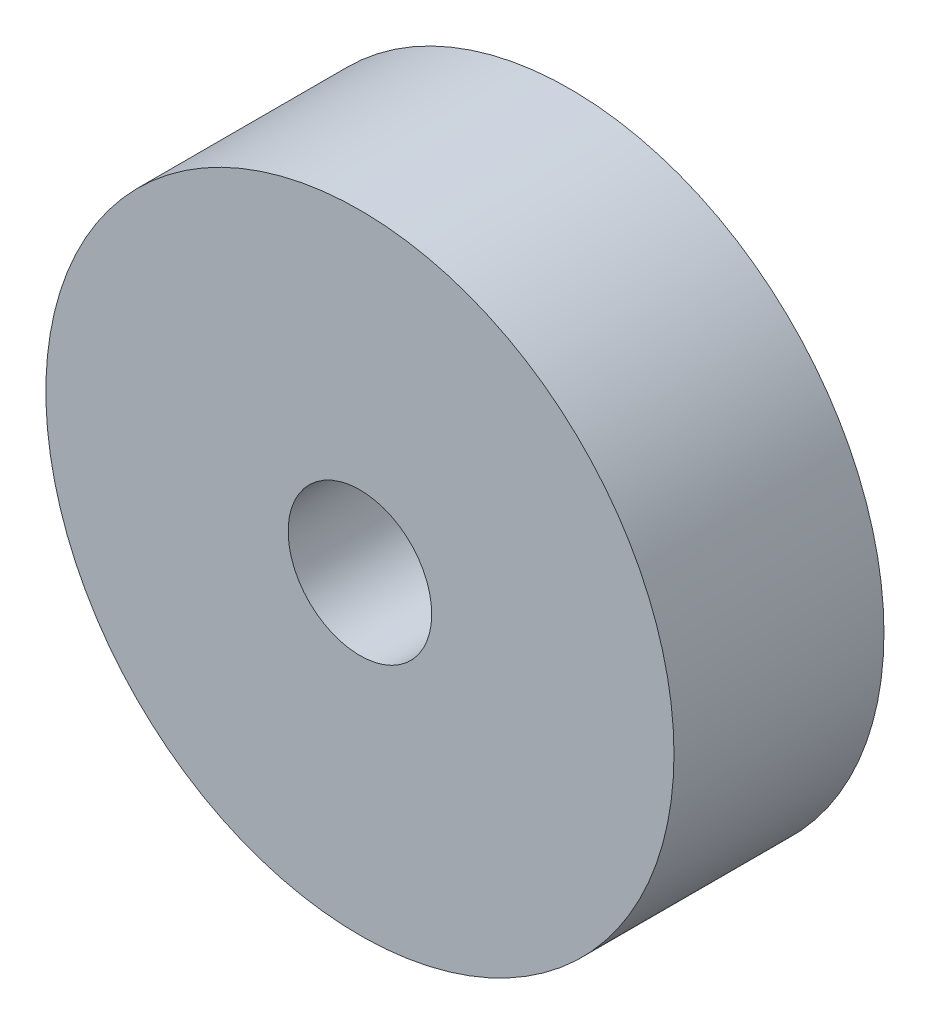
ISO-10303-21;
HEADER;
FILE_DESCRIPTION(('STEP AP214'),'2;1');
FILE_NAME('part.step','',(''),(''),'','','');
FILE_SCHEMA(('AUTOMOTIVE_DESIGN { 1 0 10303 214 1 1 1 1 }'));
ENDSEC;
DATA;
#1=APPLICATION_CONTEXT('core data for automotive mechanical design processes');
#2=APPLICATION_PROTOCOL_DEFINITION('international standard','automotive_design',2000,#1);
#3=PRODUCT_CONTEXT('',#1,'mechanical');
#4=PRODUCT('Part','Part','',(#3));
#5=PRODUCT_RELATED_PRODUCT_CATEGORY('part','',(#4));
#6=PRODUCT_DEFINITION_FORMATION('','',#4);
#7=PRODUCT_DEFINITION_CONTEXT('part definition',#1,'design');
#8=PRODUCT_DEFINITION('design','',#6,#7);
#9=PRODUCT_DEFINITION_SHAPE('','',#8);
#10=(LENGTH_UNIT() NAMED_UNIT(*) SI_UNIT(.MILLI.,.METRE.));
#11=(NAMED_UNIT(*) PLANE_ANGLE_UNIT() SI_UNIT($,.RADIAN.));
#12=(NAMED_UNIT(*) SI_UNIT($,.STERADIAN.) SOLID_ANGLE_UNIT());
#13=UNCERTAINTY_MEASURE_WITH_UNIT(LENGTH_MEASURE(1.E-05),#10,'distance_accuracy_value','');
#14=(GEOMETRIC_REPRESENTATION_CONTEXT(3) GLOBAL_UNCERTAINTY_ASSIGNED_CONTEXT((#13)) GLOBAL_UNIT_ASSIGNED_CONTEXT((#10,
#11,#12)) REPRESENTATION_CONTEXT('',''));
#15=CARTESIAN_POINT('',(0.,0.,0.));
#16=DIRECTION('',(0.,0.,1.));
#17=DIRECTION('',(1.,0.,0.));
#18=AXIS2_PLACEMENT_3D('',#15,#16,#17);
#19=CARTESIAN_POINT('',(0.,0.,5.85));
#20=DIRECTION('',(0.,0.,1.));
#21=DIRECTION('',(1.,0.,0.));
#22=AXIS2_PLACEMENT_3D('',#19,#20,#21);
#23=PLANE('',#22);
#24=CARTESIAN_POINT('',(0.,0.,5.85));
#25=DIRECTION('',(0.,0.,1.));
#26=DIRECTION('',(1.,0.,0.));
#27=AXIS2_PLACEMENT_3D('',#24,#25,#26);
#28=CIRCLE('',#27,17.5);
#29=CARTESIAN_POINT('',(17.5,0.,5.85));
#30=VERTEX_POINT('',#29);
#31=EDGE_CURVE('E10',#30,#30,#28,.T.);
#32=ORIENTED_EDGE('',*,*,#31,.T.);
#33=EDGE_LOOP('',(#32));
#34=FACE_BOUND('',#33,.T.);
#35=CARTESIAN_POINT('',(0.,0.,5.85));
#36=DIRECTION('',(0.,0.,1.));
#37=DIRECTION('',(1.,0.,0.));
#38=AXIS2_PLACEMENT_3D('',#35,#36,#37);
#39=CIRCLE('',#38,4.);
#40=CARTESIAN_POINT('',(4.,0.,5.85));
#41=VERTEX_POINT('',#40);
#42=EDGE_CURVE('E57',#41,#41,#39,.T.);
#43=ORIENTED_EDGE('',*,*,#42,.F.);
#44=EDGE_LOOP('',(#43));
#45=FACE_BOUND('',#44,.T.);
#46=ADVANCED_FACE('F43',(#34,#45),#23,.T.);
#47=CARTESIAN_POINT('',(0.,0.,-5.85));
#48=DIRECTION('',(0.,0.,1.));
#49=DIRECTION('',(1.,0.,0.));
#50=AXIS2_PLACEMENT_3D('',#47,#48,#49);
#51=PLANE('',#50);
#52=CARTESIAN_POINT('',(0.,0.,-5.85));
#53=DIRECTION('',(0.,0.,1.));
#54=DIRECTION('',(1.,0.,0.));
#55=AXIS2_PLACEMENT_3D('',#52,#53,#54);
#56=CIRCLE('',#55,17.5);
#57=CARTESIAN_POINT('',(17.5,0.,-5.85));
#58=VERTEX_POINT('',#57);
#59=EDGE_CURVE('E50',#58,#58,#56,.T.);
#60=ORIENTED_EDGE('',*,*,#59,.F.);
#61=EDGE_LOOP('',(#60));
#62=FACE_BOUND('',#61,.T.);
#63=CARTESIAN_POINT('',(0.,0.,-5.85));
#64=DIRECTION('',(0.,0.,1.));
#65=DIRECTION('',(1.,0.,0.));
#66=AXIS2_PLACEMENT_3D('',#63,#64,#65);
#67=CIRCLE('',#66,4.);
#68=CARTESIAN_POINT('',(4.,0.,-5.85));
#69=VERTEX_POINT('',#68);
#70=EDGE_CURVE('E59',#69,#69,#67,.T.);
#71=ORIENTED_EDGE('',*,*,#70,.T.);
#72=EDGE_LOOP('',(#71));
#73=FACE_BOUND('',#72,.T.);
#74=ADVANCED_FACE('F68',(#62,#73),#51,.F.);
#75=CARTESIAN_POINT('',(0.,0.,5.85));
#76=DIRECTION('',(0.,0.,-1.));
#77=DIRECTION('',(-1.,0.,0.));
#78=AXIS2_PLACEMENT_3D('',#75,#76,#77);
#79=CYLINDRICAL_SURFACE('',#78,17.5);
#80=ORIENTED_EDGE('',*,*,#31,.F.);
#81=EDGE_LOOP('',(#80));
#82=FACE_BOUND('',#81,.T.);
#83=ORIENTED_EDGE('',*,*,#59,.T.);
#84=EDGE_LOOP('',(#83));
#85=FACE_BOUND('',#84,.T.);
#86=ADVANCED_FACE('F44',(#82,#85),#79,.T.);
#87=CARTESIAN_POINT('',(0.,0.,5.85));
#88=DIRECTION('',(0.,0.,-1.));
#89=DIRECTION('',(-1.,0.,0.));
#90=AXIS2_PLACEMENT_3D('',#87,#88,#89);
#91=CYLINDRICAL_SURFACE('',#90,4.);
#92=ORIENTED_EDGE('',*,*,#42,.T.);
#93=EDGE_LOOP('',(#92));
#94=FACE_BOUND('',#93,.T.);
#95=ORIENTED_EDGE('',*,*,#70,.F.);
#96=EDGE_LOOP('',(#95));
#97=FACE_BOUND('',#96,.T.);
#98=ADVANCED_FACE('F67',(#94,#97),#91,.F.);
#99=CLOSED_SHELL('',(#46,#74,#86,#98));
#100=MANIFOLD_SOLID_BREP('B2',#99);
#101=ADVANCED_BREP_SHAPE_REPRESENTATION('',(#18,#100),#14);
#102=SHAPE_DEFINITION_REPRESENTATION(#9,#101);
ENDSEC;
END-ISO-10303-21;
